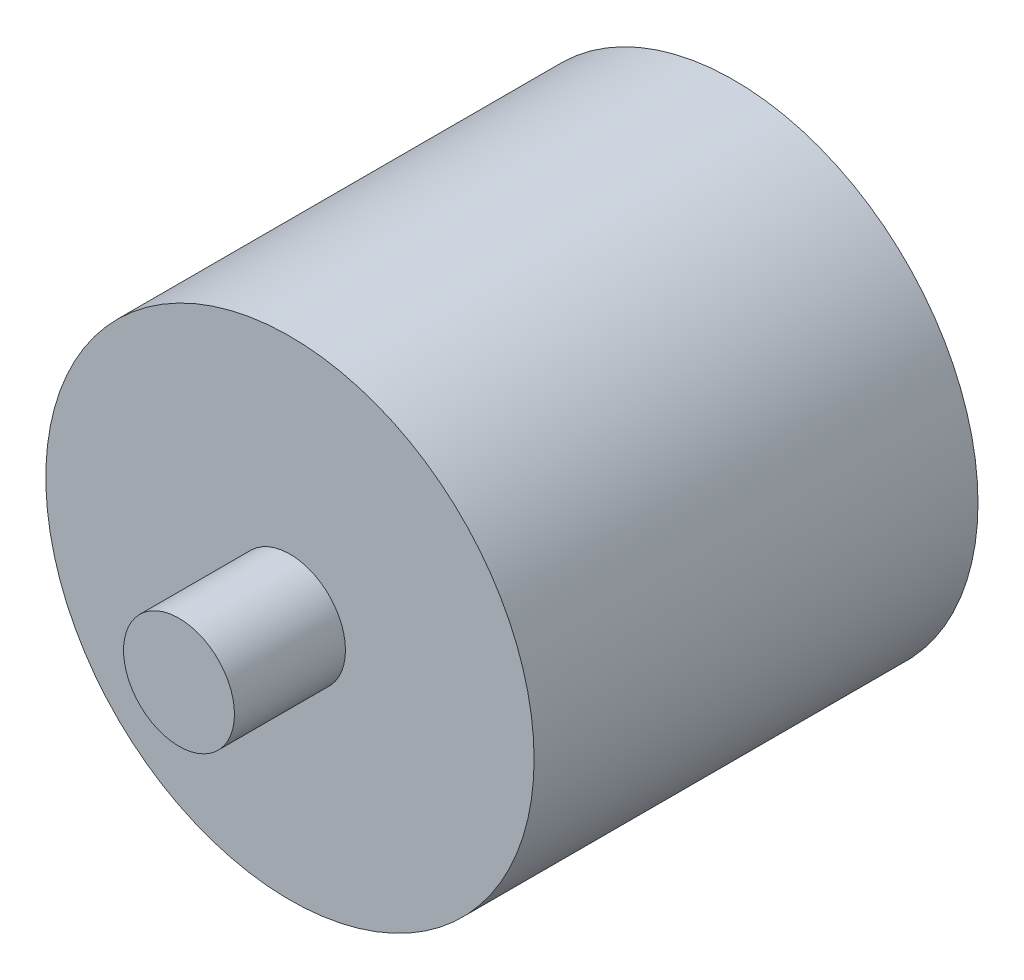
ISO-10303-21;
HEADER;
FILE_DESCRIPTION(('STEP AP214'),'2;1');
FILE_NAME('part.step','',(''),(''),'','','');
FILE_SCHEMA(('AUTOMOTIVE_DESIGN { 1 0 10303 214 1 1 1 1 }'));
ENDSEC;
DATA;
#1=APPLICATION_CONTEXT('core data for automotive mechanical design processes');
#2=APPLICATION_PROTOCOL_DEFINITION('international standard','automotive_design',2000,#1);
#3=PRODUCT_CONTEXT('',#1,'mechanical');
#4=PRODUCT('Part','Part','',(#3));
#5=PRODUCT_RELATED_PRODUCT_CATEGORY('part','',(#4));
#6=PRODUCT_DEFINITION_FORMATION('','',#4);
#7=PRODUCT_DEFINITION_CONTEXT('part definition',#1,'design');
#8=PRODUCT_DEFINITION('design','',#6,#7);
#9=PRODUCT_DEFINITION_SHAPE('','',#8);
#10=(LENGTH_UNIT() NAMED_UNIT(*) SI_UNIT(.MILLI.,.METRE.));
#11=(NAMED_UNIT(*) PLANE_ANGLE_UNIT() SI_UNIT($,.RADIAN.));
#12=(NAMED_UNIT(*) SI_UNIT($,.STERADIAN.) SOLID_ANGLE_UNIT());
#13=UNCERTAINTY_MEASURE_WITH_UNIT(LENGTH_MEASURE(1.E-05),#10,'distance_accuracy_value','');
#14=(GEOMETRIC_REPRESENTATION_CONTEXT(3) GLOBAL_UNCERTAINTY_ASSIGNED_CONTEXT((#13)) GLOBAL_UNIT_ASSIGNED_CONTEXT((#10,
#11,#12)) REPRESENTATION_CONTEXT('',''));
#15=CARTESIAN_POINT('',(0.,0.,0.));
#16=DIRECTION('',(0.,0.,1.));
#17=DIRECTION('',(1.,0.,0.));
#18=AXIS2_PLACEMENT_3D('',#15,#16,#17);
#19=CARTESIAN_POINT('',(0.,0.,20.));
#20=DIRECTION('',(0.,0.,-1.));
#21=DIRECTION('',(-1.,0.,0.));
#22=AXIS2_PLACEMENT_3D('',#19,#20,#21);
#23=CYLINDRICAL_SURFACE('',#22,11.);
#24=CARTESIAN_POINT('',(0.,0.,20.));
#25=DIRECTION('',(0.,0.,1.));
#26=DIRECTION('',(1.,0.,0.));
#27=AXIS2_PLACEMENT_3D('',#24,#25,#26);
#28=CIRCLE('',#27,11.);
#29=CARTESIAN_POINT('',(11.,0.,20.));
#30=VERTEX_POINT('',#29);
#31=EDGE_CURVE('E44',#30,#30,#28,.T.);
#32=ORIENTED_EDGE('',*,*,#31,.F.);
#33=EDGE_LOOP('',(#32));
#34=FACE_BOUND('',#33,.T.);
#35=CARTESIAN_POINT('',(0.,0.,0.));
#36=DIRECTION('',(0.,0.,1.));
#37=DIRECTION('',(1.,0.,0.));
#38=AXIS2_PLACEMENT_3D('',#35,#36,#37);
#39=CIRCLE('',#38,11.);
#40=CARTESIAN_POINT('',(11.,0.,0.));
#41=VERTEX_POINT('',#40);
#42=EDGE_CURVE('E40',#41,#41,#39,.T.);
#43=ORIENTED_EDGE('',*,*,#42,.T.);
#44=EDGE_LOOP('',(#43));
#45=FACE_BOUND('',#44,.T.);
#46=ADVANCED_FACE('F37',(#34,#45),#23,.T.);
#47=CARTESIAN_POINT('',(0.,0.,20.));
#48=DIRECTION('',(0.,0.,1.));
#49=DIRECTION('',(1.,0.,0.));
#50=AXIS2_PLACEMENT_3D('',#47,#48,#49);
#51=PLANE('',#50);
#52=CARTESIAN_POINT('',(0.,0.,20.));
#53=DIRECTION('',(0.,0.,1.));
#54=DIRECTION('',(1.,0.,0.));
#55=AXIS2_PLACEMENT_3D('',#52,#53,#54);
#56=CIRCLE('',#55,2.5);
#57=CARTESIAN_POINT('',(2.5,0.,20.));
#58=VERTEX_POINT('',#57);
#59=EDGE_CURVE('E10',#58,#58,#56,.T.);
#60=ORIENTED_EDGE('',*,*,#59,.F.);
#61=EDGE_LOOP('',(#60));
#62=FACE_BOUND('',#61,.T.);
#63=ORIENTED_EDGE('',*,*,#31,.T.);
#64=EDGE_LOOP('',(#63));
#65=FACE_BOUND('',#64,.T.);
#66=ADVANCED_FACE('F61',(#62,#65),#51,.T.);
#67=CARTESIAN_POINT('',(0.,0.,0.));
#68=DIRECTION('',(0.,0.,1.));
#69=DIRECTION('',(1.,0.,0.));
#70=AXIS2_PLACEMENT_3D('',#67,#68,#69);
#71=PLANE('',#70);
#72=ORIENTED_EDGE('',*,*,#42,.F.);
#73=EDGE_LOOP('',(#72));
#74=FACE_BOUND('',#73,.T.);
#75=ADVANCED_FACE('F58',(#74),#71,.F.);
#76=CARTESIAN_POINT('',(0.,0.,25.));
#77=DIRECTION('',(0.,0.,-1.));
#78=DIRECTION('',(-1.,0.,0.));
#79=AXIS2_PLACEMENT_3D('',#76,#77,#78);
#80=CYLINDRICAL_SURFACE('',#79,2.5);
#81=CARTESIAN_POINT('',(0.,0.,25.));
#82=DIRECTION('',(0.,0.,1.));
#83=DIRECTION('',(1.,0.,0.));
#84=AXIS2_PLACEMENT_3D('',#81,#82,#83);
#85=CIRCLE('',#84,2.5);
#86=CARTESIAN_POINT('',(2.5,0.,25.));
#87=VERTEX_POINT('',#86);
#88=EDGE_CURVE('E50',#87,#87,#85,.T.);
#89=ORIENTED_EDGE('',*,*,#88,.F.);
#90=EDGE_LOOP('',(#89));
#91=FACE_BOUND('',#90,.T.);
#92=ORIENTED_EDGE('',*,*,#59,.T.);
#93=EDGE_LOOP('',(#92));
#94=FACE_BOUND('',#93,.T.);
#95=ADVANCED_FACE('F60',(#91,#94),#80,.T.);
#96=CARTESIAN_POINT('',(0.,0.,25.));
#97=DIRECTION('',(0.,0.,1.));
#98=DIRECTION('',(1.,0.,0.));
#99=AXIS2_PLACEMENT_3D('',#96,#97,#98);
#100=PLANE('',#99);
#101=ORIENTED_EDGE('',*,*,#88,.T.);
#102=EDGE_LOOP('',(#101));
#103=FACE_BOUND('',#102,.T.);
#104=ADVANCED_FACE('F66',(#103),#100,.T.);
#105=CLOSED_SHELL('',(#46,#66,#75,#95,#104));
#106=MANIFOLD_SOLID_BREP('B2',#105);
#107=ADVANCED_BREP_SHAPE_REPRESENTATION('',(#18,#106),#14);
#108=SHAPE_DEFINITION_REPRESENTATION(#9,#107);
ENDSEC;
END-ISO-10303-21;
